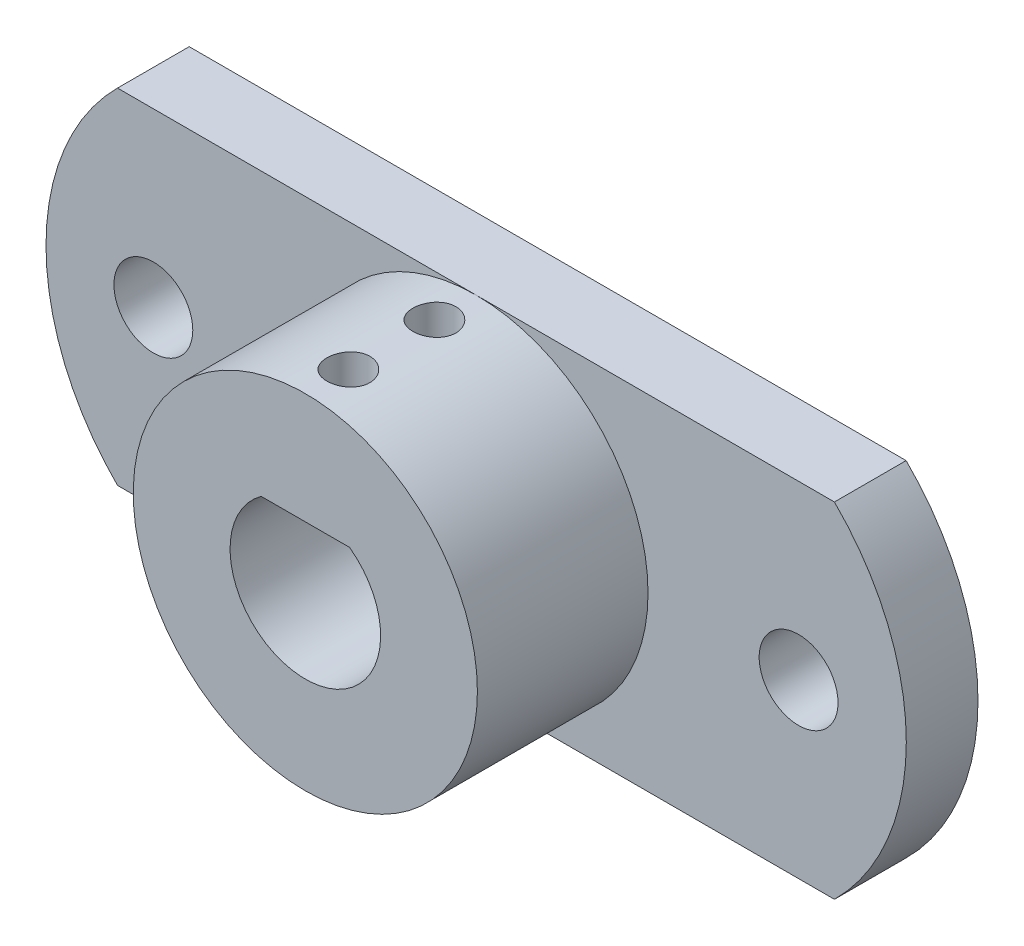
ISO-10303-21;
HEADER;
FILE_DESCRIPTION(('STEP AP214'),'2;1');
FILE_NAME('part.step','',(''),(''),'','','');
FILE_SCHEMA(('AUTOMOTIVE_DESIGN { 1 0 10303 214 1 1 1 1 }'));
ENDSEC;
DATA;
#1=APPLICATION_CONTEXT('core data for automotive mechanical design processes');
#2=APPLICATION_PROTOCOL_DEFINITION('international standard','automotive_design',2000,#1);
#3=PRODUCT_CONTEXT('',#1,'mechanical');
#4=PRODUCT('Part','Part','',(#3));
#5=PRODUCT_RELATED_PRODUCT_CATEGORY('part','',(#4));
#6=PRODUCT_DEFINITION_FORMATION('','',#4);
#7=PRODUCT_DEFINITION_CONTEXT('part definition',#1,'design');
#8=PRODUCT_DEFINITION('design','',#6,#7);
#9=PRODUCT_DEFINITION_SHAPE('','',#8);
#10=(LENGTH_UNIT() NAMED_UNIT(*) SI_UNIT(.MILLI.,.METRE.));
#11=(NAMED_UNIT(*) PLANE_ANGLE_UNIT() SI_UNIT($,.RADIAN.));
#12=(NAMED_UNIT(*) SI_UNIT($,.STERADIAN.) SOLID_ANGLE_UNIT());
#13=UNCERTAINTY_MEASURE_WITH_UNIT(LENGTH_MEASURE(1.E-05),#10,'distance_accuracy_value','');
#14=(GEOMETRIC_REPRESENTATION_CONTEXT(3) GLOBAL_UNCERTAINTY_ASSIGNED_CONTEXT((#13)) GLOBAL_UNIT_ASSIGNED_CONTEXT((#10,
#11,#12)) REPRESENTATION_CONTEXT('',''));
#15=CARTESIAN_POINT('',(0.,0.,0.));
#16=DIRECTION('',(0.,0.,1.));
#17=DIRECTION('',(1.,0.,0.));
#18=AXIS2_PLACEMENT_3D('',#15,#16,#17);
#19=CARTESIAN_POINT('',(-13.0564979088763,-12.,2.5));
#20=DIRECTION('',(0.,0.,1.));
#21=DIRECTION('',(1.,0.,0.));
#22=AXIS2_PLACEMENT_3D('',#19,#20,#21);
#23=PLANE('',#22);
#24=CARTESIAN_POINT('',(0.,-12.,2.5));
#25=DIRECTION('',(0.,0.,1.));
#26=DIRECTION('',(1.,0.,0.));
#27=AXIS2_PLACEMENT_3D('',#24,#25,#26);
#28=CIRCLE('',#27,12.);
#29=CARTESIAN_POINT('',(0.,0.,2.5));
#30=VERTEX_POINT('',#29);
#31=CARTESIAN_POINT('',(0.,-24.,2.5));
#32=VERTEX_POINT('',#31);
#33=EDGE_CURVE('E45',#30,#32,#28,.T.);
#34=ORIENTED_EDGE('',*,*,#33,.F.);
#35=DIRECTION('',(-1.,0.,0.));
#36=VECTOR('',#35,1.);
#37=CARTESIAN_POINT('',(-25.,0.,2.5));
#38=LINE('',#37,#36);
#39=CARTESIAN_POINT('',(-25.,0.,2.5));
#40=VERTEX_POINT('',#39);
#41=EDGE_CURVE('E143',#30,#40,#38,.T.);
#42=ORIENTED_EDGE('',*,*,#41,.T.);
#43=CARTESIAN_POINT('',(-13.0564979088763,-12.,2.5));
#44=DIRECTION('',(0.,0.,1.));
#45=DIRECTION('',(1.,0.,0.));
#46=AXIS2_PLACEMENT_3D('',#43,#44,#45);
#47=CIRCLE('',#46,16.9306598276817);
#48=CARTESIAN_POINT('',(-25.,-24.,2.5));
#49=VERTEX_POINT('',#48);
#50=EDGE_CURVE('E133',#40,#49,#47,.T.);
#51=ORIENTED_EDGE('',*,*,#50,.T.);
#52=DIRECTION('',(1.,0.,0.));
#53=VECTOR('',#52,1.);
#54=CARTESIAN_POINT('',(-25.,-24.,2.5));
#55=LINE('',#54,#53);
#56=EDGE_CURVE('E138',#49,#32,#55,.T.);
#57=ORIENTED_EDGE('',*,*,#56,.T.);
#58=EDGE_LOOP('',(#34,#42,#51,#57));
#59=FACE_BOUND('',#58,.T.);
#60=CARTESIAN_POINT('',(-22.5,-12.,2.5));
#61=DIRECTION('',(0.,0.,1.));
#62=DIRECTION('',(1.,0.,0.));
#63=AXIS2_PLACEMENT_3D('',#60,#61,#62);
#64=CIRCLE('',#63,2.75);
#65=CARTESIAN_POINT('',(-19.75,-12.,2.5));
#66=VERTEX_POINT('',#65);
#67=EDGE_CURVE('E121',#66,#66,#64,.T.);
#68=ORIENTED_EDGE('',*,*,#67,.F.);
#69=EDGE_LOOP('',(#68));
#70=FACE_BOUND('',#69,.T.);
#71=ADVANCED_FACE('F35',(#59,#70),#23,.T.);
#72=EDGE_CURVE('E11',#32,#30,#28,.T.);
#73=ORIENTED_EDGE('',*,*,#72,.F.);
#74=CARTESIAN_POINT('',(25.,-24.,2.5));
#75=VERTEX_POINT('',#74);
#76=EDGE_CURVE('E136',#32,#75,#55,.T.);
#77=ORIENTED_EDGE('',*,*,#76,.T.);
#78=CARTESIAN_POINT('',(13.143312097733,-12.,2.5));
#79=DIRECTION('',(0.,0.,1.));
#80=DIRECTION('',(1.,0.,0.));
#81=AXIS2_PLACEMENT_3D('',#78,#79,#80);
#82=CIRCLE('',#81,16.869530165709);
#83=CARTESIAN_POINT('',(25.,0.,2.5));
#84=VERTEX_POINT('',#83);
#85=EDGE_CURVE('E141',#75,#84,#82,.T.);
#86=ORIENTED_EDGE('',*,*,#85,.T.);
#87=EDGE_CURVE('E144',#84,#30,#38,.T.);
#88=ORIENTED_EDGE('',*,*,#87,.T.);
#89=EDGE_LOOP('',(#73,#77,#86,#88));
#90=FACE_BOUND('',#89,.T.);
#91=CARTESIAN_POINT('',(22.5,-12.,2.5));
#92=DIRECTION('',(0.,0.,1.));
#93=DIRECTION('',(1.,0.,0.));
#94=AXIS2_PLACEMENT_3D('',#91,#92,#93);
#95=CIRCLE('',#94,2.75);
#96=CARTESIAN_POINT('',(25.25,-12.,2.5));
#97=VERTEX_POINT('',#96);
#98=EDGE_CURVE('E127',#97,#97,#95,.T.);
#99=ORIENTED_EDGE('',*,*,#98,.F.);
#100=EDGE_LOOP('',(#99));
#101=FACE_BOUND('',#100,.T.);
#102=ADVANCED_FACE('F183',(#90,#101),#23,.T.);
#103=CARTESIAN_POINT('',(-13.0564979088763,-12.,-2.5));
#104=DIRECTION('',(0.,0.,1.));
#105=DIRECTION('',(1.,0.,0.));
#106=AXIS2_PLACEMENT_3D('',#103,#104,#105);
#107=PLANE('',#106);
#108=CARTESIAN_POINT('',(-13.0564979088763,-12.,-2.5));
#109=DIRECTION('',(0.,0.,1.));
#110=DIRECTION('',(1.,0.,0.));
#111=AXIS2_PLACEMENT_3D('',#108,#109,#110);
#112=CIRCLE('',#111,16.9306598276817);
#113=CARTESIAN_POINT('',(-25.,0.,-2.5));
#114=VERTEX_POINT('',#113);
#115=CARTESIAN_POINT('',(-25.,-24.,-2.5));
#116=VERTEX_POINT('',#115);
#117=EDGE_CURVE('E130',#114,#116,#112,.T.);
#118=ORIENTED_EDGE('',*,*,#117,.F.);
#119=DIRECTION('',(-1.,0.,0.));
#120=VECTOR('',#119,1.);
#121=CARTESIAN_POINT('',(-25.,0.,-2.5));
#122=LINE('',#121,#120);
#123=CARTESIAN_POINT('',(25.,0.,-2.5));
#124=VERTEX_POINT('',#123);
#125=EDGE_CURVE('E137',#124,#114,#122,.T.);
#126=ORIENTED_EDGE('',*,*,#125,.F.);
#127=CARTESIAN_POINT('',(13.143312097733,-12.,-2.5));
#128=DIRECTION('',(0.,0.,1.));
#129=DIRECTION('',(1.,0.,0.));
#130=AXIS2_PLACEMENT_3D('',#127,#128,#129);
#131=CIRCLE('',#130,16.869530165709);
#132=CARTESIAN_POINT('',(25.,-24.,-2.5));
#133=VERTEX_POINT('',#132);
#134=EDGE_CURVE('E151',#133,#124,#131,.T.);
#135=ORIENTED_EDGE('',*,*,#134,.F.);
#136=DIRECTION('',(1.,0.,0.));
#137=VECTOR('',#136,1.);
#138=CARTESIAN_POINT('',(-25.,-24.,-2.5));
#139=LINE('',#138,#137);
#140=EDGE_CURVE('E149',#116,#133,#139,.T.);
#141=ORIENTED_EDGE('',*,*,#140,.F.);
#142=EDGE_LOOP('',(#118,#126,#135,#141));
#143=FACE_BOUND('',#142,.T.);
#144=CARTESIAN_POINT('',(22.5,-12.,-2.5));
#145=DIRECTION('',(0.,0.,1.));
#146=DIRECTION('',(1.,0.,0.));
#147=AXIS2_PLACEMENT_3D('',#144,#145,#146);
#148=CIRCLE('',#147,2.75);
#149=CARTESIAN_POINT('',(25.25,-12.,-2.5));
#150=VERTEX_POINT('',#149);
#151=EDGE_CURVE('E124',#150,#150,#148,.T.);
#152=ORIENTED_EDGE('',*,*,#151,.T.);
#153=EDGE_LOOP('',(#152));
#154=FACE_BOUND('',#153,.T.);
#155=CARTESIAN_POINT('',(-22.5,-12.,-2.5));
#156=DIRECTION('',(0.,0.,1.));
#157=DIRECTION('',(1.,0.,0.));
#158=AXIS2_PLACEMENT_3D('',#155,#156,#157);
#159=CIRCLE('',#158,2.75);
#160=CARTESIAN_POINT('',(-19.75,-12.,-2.5));
#161=VERTEX_POINT('',#160);
#162=EDGE_CURVE('E118',#161,#161,#159,.T.);
#163=ORIENTED_EDGE('',*,*,#162,.T.);
#164=EDGE_LOOP('',(#163));
#165=FACE_BOUND('',#164,.T.);
#166=ADVANCED_FACE('F174',(#143,#154,#165),#107,.F.);
#167=CARTESIAN_POINT('',(-13.0564979088763,-12.,2.5));
#168=DIRECTION('',(0.,0.,-1.));
#169=DIRECTION('',(-1.,0.,0.));
#170=AXIS2_PLACEMENT_3D('',#167,#168,#169);
#171=CYLINDRICAL_SURFACE('',#170,16.9306598276817);
#172=ORIENTED_EDGE('',*,*,#117,.T.);
#173=DIRECTION('',(0.,0.,-1.));
#174=VECTOR('',#173,1.);
#175=CARTESIAN_POINT('',(-25.,-24.,2.5));
#176=LINE('',#175,#174);
#177=EDGE_CURVE('E39',#49,#116,#176,.T.);
#178=ORIENTED_EDGE('',*,*,#177,.F.);
#179=ORIENTED_EDGE('',*,*,#50,.F.);
#180=DIRECTION('',(0.,0.,-1.));
#181=VECTOR('',#180,1.);
#182=CARTESIAN_POINT('',(-25.,0.,2.5));
#183=LINE('',#182,#181);
#184=EDGE_CURVE('E146',#40,#114,#183,.T.);
#185=ORIENTED_EDGE('',*,*,#184,.T.);
#186=EDGE_LOOP('',(#172,#178,#179,#185));
#187=FACE_BOUND('',#186,.T.);
#188=ADVANCED_FACE('F37',(#187),#171,.T.);
#189=CARTESIAN_POINT('',(-25.,-24.,2.5));
#190=DIRECTION('',(0.,1.,0.));
#191=DIRECTION('',(0.,0.,1.));
#192=AXIS2_PLACEMENT_3D('',#189,#190,#191);
#193=PLANE('',#192);
#194=ORIENTED_EDGE('',*,*,#140,.T.);
#195=DIRECTION('',(0.,0.,-1.));
#196=VECTOR('',#195,1.);
#197=CARTESIAN_POINT('',(25.,-24.,2.5));
#198=LINE('',#197,#196);
#199=EDGE_CURVE('E158',#75,#133,#198,.T.);
#200=ORIENTED_EDGE('',*,*,#199,.F.);
#201=ORIENTED_EDGE('',*,*,#76,.F.);
#202=ORIENTED_EDGE('',*,*,#56,.F.);
#203=ORIENTED_EDGE('',*,*,#177,.T.);
#204=EDGE_LOOP('',(#194,#200,#201,#202,#203));
#205=FACE_BOUND('',#204,.T.);
#206=ADVANCED_FACE('F167',(#205),#193,.F.);
#207=CARTESIAN_POINT('',(13.143312097733,-12.,2.5));
#208=DIRECTION('',(0.,0.,-1.));
#209=DIRECTION('',(-1.,0.,0.));
#210=AXIS2_PLACEMENT_3D('',#207,#208,#209);
#211=CYLINDRICAL_SURFACE('',#210,16.869530165709);
#212=ORIENTED_EDGE('',*,*,#134,.T.);
#213=DIRECTION('',(0.,0.,-1.));
#214=VECTOR('',#213,1.);
#215=CARTESIAN_POINT('',(25.,0.,2.5));
#216=LINE('',#215,#214);
#217=EDGE_CURVE('E156',#84,#124,#216,.T.);
#218=ORIENTED_EDGE('',*,*,#217,.F.);
#219=ORIENTED_EDGE('',*,*,#85,.F.);
#220=ORIENTED_EDGE('',*,*,#199,.T.);
#221=EDGE_LOOP('',(#212,#218,#219,#220));
#222=FACE_BOUND('',#221,.T.);
#223=ADVANCED_FACE('F177',(#222),#211,.T.);
#224=CARTESIAN_POINT('',(-25.,0.,2.5));
#225=DIRECTION('',(0.,-1.,0.));
#226=DIRECTION('',(1.,0.,0.));
#227=AXIS2_PLACEMENT_3D('',#224,#225,#226);
#228=PLANE('',#227);
#229=ORIENTED_EDGE('',*,*,#125,.T.);
#230=ORIENTED_EDGE('',*,*,#184,.F.);
#231=ORIENTED_EDGE('',*,*,#41,.F.);
#232=ORIENTED_EDGE('',*,*,#87,.F.);
#233=ORIENTED_EDGE('',*,*,#217,.T.);
#234=EDGE_LOOP('',(#229,#230,#231,#232,#233));
#235=FACE_BOUND('',#234,.T.);
#236=ADVANCED_FACE('F180',(#235),#228,.F.);
#237=CARTESIAN_POINT('',(22.5,-12.,2.5));
#238=DIRECTION('',(0.,0.,-1.));
#239=DIRECTION('',(-1.,0.,0.));
#240=AXIS2_PLACEMENT_3D('',#237,#238,#239);
#241=CYLINDRICAL_SURFACE('',#240,2.75);
#242=ORIENTED_EDGE('',*,*,#98,.T.);
#243=EDGE_LOOP('',(#242));
#244=FACE_BOUND('',#243,.T.);
#245=ORIENTED_EDGE('',*,*,#151,.F.);
#246=EDGE_LOOP('',(#245));
#247=FACE_BOUND('',#246,.T.);
#248=ADVANCED_FACE('F200',(#244,#247),#241,.F.);
#249=CARTESIAN_POINT('',(-22.5,-12.,2.5));
#250=DIRECTION('',(0.,0.,-1.));
#251=DIRECTION('',(-1.,0.,0.));
#252=AXIS2_PLACEMENT_3D('',#249,#250,#251);
#253=CYLINDRICAL_SURFACE('',#252,2.75);
#254=ORIENTED_EDGE('',*,*,#67,.T.);
#255=EDGE_LOOP('',(#254));
#256=FACE_BOUND('',#255,.T.);
#257=ORIENTED_EDGE('',*,*,#162,.F.);
#258=EDGE_LOOP('',(#257));
#259=FACE_BOUND('',#258,.T.);
#260=ADVANCED_FACE('F191',(#256,#259),#253,.F.);
#261=CARTESIAN_POINT('',(0.,-12.,14.4));
#262=DIRECTION('',(0.,0.,-1.));
#263=DIRECTION('',(-1.,0.,0.));
#264=AXIS2_PLACEMENT_3D('',#261,#262,#263);
#265=CYLINDRICAL_SURFACE('',#264,12.);
#266=CARTESIAN_POINT('',(0.,0.,3.9));
#267=CARTESIAN_POINT('',(0.0839046573334568,-1.17062142931432E-06,3.90000356456143));
#268=CARTESIAN_POINT('',(0.167861744581648,-0.000889292670590313,3.90706372750157));
#269=CARTESIAN_POINT('',(0.333439681253852,-0.00434675933183943,3.93511665274248));
#270=CARTESIAN_POINT('',(0.415057998374247,-0.00691785935142624,3.95612396275403));
#271=CARTESIAN_POINT('',(0.573537344887833,-0.0134516337335631,4.01144258634845));
#272=CARTESIAN_POINT('',(0.650401536087683,-0.0174133712667472,4.04574494508591));
#273=CARTESIAN_POINT('',(0.797267684935822,-0.0262877947314137,4.12666037038188));
#274=CARTESIAN_POINT('',(0.867270816933823,-0.0312003174953041,4.17327132511843));
#275=CARTESIAN_POINT('',(0.99882769015879,-0.0414580721620438,4.27775516990376));
#276=CARTESIAN_POINT('',(1.06033821896228,-0.0468053118454965,4.33568227760774));
#277=CARTESIAN_POINT('',(1.1727916761345,-0.0573136439414972,4.46103769412199));
#278=CARTESIAN_POINT('',(1.22373406583535,-0.0624747268543901,4.52846648694795));
#279=CARTESIAN_POINT('',(1.31376609677036,-0.072046166282491,4.6711919865394));
#280=CARTESIAN_POINT('',(1.35281525756464,-0.076453936932533,4.74651441694077));
#281=CARTESIAN_POINT('',(1.41769384594507,-0.0839932292539044,4.90271223116842));
#282=CARTESIAN_POINT('',(1.44352377483913,-0.0871247993211864,4.98358740428821));
#283=CARTESIAN_POINT('',(1.48109938801486,-0.091737962378319,5.14814651735206));
#284=CARTESIAN_POINT('',(1.49291802883902,-0.0932280993795317,5.23181355462252));
#285=CARTESIAN_POINT('',(1.50236132973434,-0.0944158311432489,5.3999557580831));
#286=CARTESIAN_POINT('',(1.49998656060145,-0.0941134979909518,5.48443089163877));
#287=CARTESIAN_POINT('',(1.48117034186874,-0.0917582677814881,5.65128289634927));
#288=CARTESIAN_POINT('',(1.46480925779082,-0.0897153722380293,5.73366899172016));
#289=CARTESIAN_POINT('',(1.41861022990923,-0.0841248014542288,5.89451701273139));
#290=CARTESIAN_POINT('',(1.38877201305114,-0.0805770957256601,5.97297885882842));
#291=CARTESIAN_POINT('',(1.31637933594699,-0.0723653048120923,6.12400079941301));
#292=CARTESIAN_POINT('',(1.27378995222458,-0.0676981607313357,6.19654398014939));
#293=CARTESIAN_POINT('',(1.17712888167415,-0.0577757314164156,6.33348401664795));
#294=CARTESIAN_POINT('',(1.12305666964847,-0.0525204192860254,6.39788049958421));
#295=CARTESIAN_POINT('',(1.00451946645227,-0.0419693406574511,6.51716562643365));
#296=CARTESIAN_POINT('',(0.939985204704006,-0.0366735456786602,6.57198545505959));
#297=CARTESIAN_POINT('',(0.802594301468353,-0.0266722046648852,6.67002532801833));
#298=CARTESIAN_POINT('',(0.72973764079095,-0.0219666599909685,6.7132453456032));
#299=CARTESIAN_POINT('',(0.577717002818088,-0.0136730866885221,6.78685879227835));
#300=CARTESIAN_POINT('',(0.498550917202629,-0.0100854335907812,6.81724791232874));
#301=CARTESIAN_POINT('',(0.336184764258633,-0.00443528531963272,6.86428229611395));
#302=CARTESIAN_POINT('',(0.2529848859784,-0.00237271874478478,6.88092820328223));
#303=CARTESIAN_POINT('',(0.0855078983480979,-1.44215354400202E-05,6.89991445455633));
#304=CARTESIAN_POINT('',(0.00124169411916386,0.000293016855811702,6.90234959541844));
#305=CARTESIAN_POINT('',(-0.166497621898498,-0.000861971967422323,6.89309535956643));
#306=CARTESIAN_POINT('',(-0.249970750538824,-0.00232436149072459,6.88140628364904));
#307=CARTESIAN_POINT('',(-0.413474704632913,-0.00684738745985124,6.84431417473537));
#308=CARTESIAN_POINT('',(-0.493515942254823,-0.00990275511679224,6.81895634195842));
#309=CARTESIAN_POINT('',(-0.648209792915044,-0.0172696613988188,6.75529352885225));
#310=CARTESIAN_POINT('',(-0.722862222879189,-0.0215812426762598,6.71698810890514));
#311=CARTESIAN_POINT('',(-0.865082712412456,-0.0310090625393267,6.62828811749552));
#312=CARTESIAN_POINT('',(-0.932612255966292,-0.0361293357449474,6.57783222611662));
#313=CARTESIAN_POINT('',(-1.05827819377579,-0.0465891460460638,6.46635030147948));
#314=CARTESIAN_POINT('',(-1.11641421500212,-0.0519286918386125,6.40532384864941));
#315=CARTESIAN_POINT('',(-1.22197917529081,-0.0622613672244961,6.27401554994572));
#316=CARTESIAN_POINT('',(-1.26934527634076,-0.0672523516720403,6.20368299221376));
#317=CARTESIAN_POINT('',(-1.3515917336661,-0.0762875337771113,6.05600505308717));
#318=CARTESIAN_POINT('',(-1.38647234023702,-0.0803317504138403,5.97865981231409));
#319=CARTESIAN_POINT('',(-1.44265594731992,-0.0870008976420307,5.81935480851143));
#320=CARTESIAN_POINT('',(-1.46399437647427,-0.0896295288912701,5.73740770197122));
#321=CARTESIAN_POINT('',(-1.49260199632071,-0.0931805045552727,5.5710585097316));
#322=CARTESIAN_POINT('',(-1.49987184152146,-0.0941029283473419,5.4866565384246));
#323=CARTESIAN_POINT('',(-1.5001239216509,-0.094134738105271,5.31841864247719));
#324=CARTESIAN_POINT('',(-1.49320487861956,-0.0932566514882796,5.23458285100087));
#325=CARTESIAN_POINT('',(-1.4654846429096,-0.0898133127767923,5.06927572239295));
#326=CARTESIAN_POINT('',(-1.44468344874346,-0.0872480605015127,4.98780438551472));
#327=CARTESIAN_POINT('',(-1.38982024421379,-0.0807233053527023,4.82955182594016));
#328=CARTESIAN_POINT('',(-1.35576298858256,-0.0767643024432989,4.75276893298691));
#329=CARTESIAN_POINT('',(-1.27536414129019,-0.0678973005310884,4.60599200757101));
#330=CARTESIAN_POINT('',(-1.22902239570575,-0.0629892896375255,4.5359980601881));
#331=CARTESIAN_POINT('',(-1.1250037987595,-0.0527363714866023,4.40428126479572));
#332=CARTESIAN_POINT('',(-1.06725337546497,-0.0473887674958037,4.34261672342701));
#333=CARTESIAN_POINT('',(-0.942210136181029,-0.0368830104426004,4.22981590489922));
#334=CARTESIAN_POINT('',(-0.87491507348494,-0.0317249023464588,4.17868211353541));
#335=CARTESIAN_POINT('',(-0.732399372512526,-0.0221576604795203,4.08822878573682));
#336=CARTESIAN_POINT('',(-0.657149567757702,-0.0177514495301935,4.04895491646045));
#337=CARTESIAN_POINT('',(-0.501109741380769,-0.0102141055396504,3.98365725425023));
#338=CARTESIAN_POINT('',(-0.420325848522142,-0.00708158778255149,3.95761906418792));
#339=CARTESIAN_POINT('',(-0.282603463180755,-0.00319967803352443,3.92576439709722));
#340=CARTESIAN_POINT('',(-0.226533398110152,-0.00200564462727877,3.91611663481076));
#341=CARTESIAN_POINT('',(-0.113650237927461,-0.000405412024868778,3.90323325258407));
#342=CARTESIAN_POINT('',(-0.0568371482976164,7.92980817666425E-07,3.89999758536042));
#343=CARTESIAN_POINT('',(0.,0.,3.9));
#344=B_SPLINE_CURVE_WITH_KNOTS('',3,(#266,#267,#268,#269,#270,#271,#272,#273,#274,#275,#276,
#277,#278,#279,#280,#281,#282,#283,#284,#285,#286,#287,#288,#289,#290,#291,#292,#293,#294,#295,
#296,#297,#298,#299,#300,#301,#302,#303,#304,#305,#306,#307,#308,#309,#310,#311,#312,#313,#314,
#315,#316,#317,#318,#319,#320,#321,#322,#323,#324,#325,#326,#327,#328,#329,#330,#331,#332,#333,
#334,#335,#336,#337,#338,#339,#340,#341,#342,#343),.UNSPECIFIED.,.T.,.F.,(4,2,2,2,2,2,2,2,2,2,2,
2,2,2,2,2,2,2,2,2,2,2,2,2,2,2,2,2,2,2,2,2,2,2,2,2,2,2,4),(0.,0.251506363665748,
0.503275476566056,0.754875304909063,1.00643199354644,1.25922487921106,1.51203064680006,
1.76568750191322,2.01933473698084,2.27165535171792,2.52396581930798,2.77483617865015,
3.02571162099745,3.2772805577132,3.52886100308183,3.7821808688185,4.03550131867868,
4.28890677438963,4.54230036542268,4.79400167635153,5.04569762701157,5.29656632336038,
5.54744353847369,5.79961441757053,6.05179530825053,6.30541182904544,6.55902326532923,
6.81196844568555,7.06490185806374,7.31608140721329,7.56726098327729,7.81835054823893,
8.06944325947358,8.32221142615098,8.57503919082008,8.82882841822112,9.0823409921042,
9.25271305912577,9.42308386980262),.UNSPECIFIED.);
#345=CARTESIAN_POINT('',(0.,0.,3.9));
#346=VERTEX_POINT('',#345);
#347=EDGE_CURVE('E313',#346,#346,#344,.T.);
#348=ORIENTED_EDGE('',*,*,#347,.T.);
#349=EDGE_LOOP('',(#348));
#350=FACE_BOUND('',#349,.T.);
#351=CARTESIAN_POINT('',(0.,0.,9.9));
#352=CARTESIAN_POINT('',(0.0839046573334568,-1.17062142932141E-06,9.90000356456143));
#353=CARTESIAN_POINT('',(0.167861744581648,-0.000889292670590324,9.90706372750157));
#354=CARTESIAN_POINT('',(0.333439681253851,-0.00434675933183943,9.93511665274248));
#355=CARTESIAN_POINT('',(0.415057998374247,-0.00691785935142624,9.95612396275403));
#356=CARTESIAN_POINT('',(0.573537344887832,-0.0134516337335631,10.0114425863484));
#357=CARTESIAN_POINT('',(0.650401536087683,-0.0174133712667472,10.0457449450859));
#358=CARTESIAN_POINT('',(0.797267684935821,-0.0262877947314137,10.1266603703819));
#359=CARTESIAN_POINT('',(0.867270816933822,-0.0312003174953041,10.1732713251184));
#360=CARTESIAN_POINT('',(0.99882769015879,-0.0414580721620438,10.2777551699038));
#361=CARTESIAN_POINT('',(1.06033821896228,-0.0468053118454965,10.3356822776077));
#362=CARTESIAN_POINT('',(1.1727916761345,-0.0573136439414972,10.461037694122));
#363=CARTESIAN_POINT('',(1.22373406583535,-0.0624747268543901,10.5284664869479));
#364=CARTESIAN_POINT('',(1.31376609677036,-0.072046166282491,10.6711919865394));
#365=CARTESIAN_POINT('',(1.35281525756464,-0.076453936932533,10.7465144169408));
#366=CARTESIAN_POINT('',(1.41769384594507,-0.0839932292539044,10.9027122311684));
#367=CARTESIAN_POINT('',(1.44352377483913,-0.0871247993211864,10.9835874042882));
#368=CARTESIAN_POINT('',(1.48109938801486,-0.091737962378319,11.1481465173521));
#369=CARTESIAN_POINT('',(1.49291802883902,-0.0932280993795317,11.2318135546225));
#370=CARTESIAN_POINT('',(1.50236132973434,-0.094415831143249,11.3999557580831));
#371=CARTESIAN_POINT('',(1.49998656060145,-0.0941134979909518,11.4844308916388));
#372=CARTESIAN_POINT('',(1.48117034186874,-0.0917582677814882,11.6512828963493));
#373=CARTESIAN_POINT('',(1.46480925779082,-0.0897153722380293,11.7336689917202));
#374=CARTESIAN_POINT('',(1.41861022990923,-0.0841248014542289,11.8945170127314));
#375=CARTESIAN_POINT('',(1.38877201305114,-0.0805770957256601,11.9729788588284));
#376=CARTESIAN_POINT('',(1.31637933594699,-0.0723653048120925,12.124000799413));
#377=CARTESIAN_POINT('',(1.27378995222458,-0.0676981607313358,12.1965439801494));
#378=CARTESIAN_POINT('',(1.17712888167415,-0.0577757314164157,12.3334840166479));
#379=CARTESIAN_POINT('',(1.12305666964847,-0.0525204192860256,12.3978804995842));
#380=CARTESIAN_POINT('',(1.00451946645227,-0.0419693406574513,12.5171656264336));
#381=CARTESIAN_POINT('',(0.939985204704008,-0.0366735456786604,12.5719854550596));
#382=CARTESIAN_POINT('',(0.802594301468355,-0.0266722046648854,12.6700253280183));
#383=CARTESIAN_POINT('',(0.729737640790952,-0.0219666599909687,12.7132453456032));
#384=CARTESIAN_POINT('',(0.57771700281809,-0.0136730866885222,12.7868587922783));
#385=CARTESIAN_POINT('',(0.498550917202631,-0.0100854335907814,12.8172479123287));
#386=CARTESIAN_POINT('',(0.336184764258635,-0.00443528531963285,12.864282296114));
#387=CARTESIAN_POINT('',(0.252984885978401,-0.0023727187447849,12.8809282032822));
#388=CARTESIAN_POINT('',(0.0855078983480998,-1.44215354401182E-05,12.8999144545563));
#389=CARTESIAN_POINT('',(0.00124169411916571,0.000293016855811621,12.9023495954184));
#390=CARTESIAN_POINT('',(-0.166497621898496,-0.000861971967422364,12.8930953595664));
#391=CARTESIAN_POINT('',(-0.249970750538823,-0.00232436149072461,12.881406283649));
#392=CARTESIAN_POINT('',(-0.413474704632912,-0.00684738745985126,12.8443141747354));
#393=CARTESIAN_POINT('',(-0.493515942254822,-0.00990275511679226,12.8189563419584));
#394=CARTESIAN_POINT('',(-0.648209792915043,-0.0172696613988188,12.7552935288523));
#395=CARTESIAN_POINT('',(-0.722862222879187,-0.0215812426762598,12.7169881089051));
#396=CARTESIAN_POINT('',(-0.865082712412455,-0.0310090625393266,12.6282881174955));
#397=CARTESIAN_POINT('',(-0.932612255966291,-0.0361293357449474,12.5778322261166));
#398=CARTESIAN_POINT('',(-1.05827819377579,-0.0465891460460638,12.4663503014795));
#399=CARTESIAN_POINT('',(-1.11641421500211,-0.0519286918386124,12.4053238486494));
#400=CARTESIAN_POINT('',(-1.22197917529081,-0.0622613672244961,12.2740155499457));
#401=CARTESIAN_POINT('',(-1.26934527634076,-0.0672523516720404,12.2036829922138));
#402=CARTESIAN_POINT('',(-1.3515917336661,-0.0762875337771115,12.0560050530872));
#403=CARTESIAN_POINT('',(-1.38647234023702,-0.0803317504138404,11.9786598123141));
#404=CARTESIAN_POINT('',(-1.44265594731992,-0.0870008976420307,11.8193548085114));
#405=CARTESIAN_POINT('',(-1.46399437647426,-0.0896295288912701,11.7374077019712));
#406=CARTESIAN_POINT('',(-1.49260199632071,-0.0931805045552727,11.5710585097316));
#407=CARTESIAN_POINT('',(-1.49987184152146,-0.0941029283473419,11.4866565384246));
#408=CARTESIAN_POINT('',(-1.5001239216509,-0.0941347381052711,11.3184186424772));
#409=CARTESIAN_POINT('',(-1.49320487861956,-0.0932566514882799,11.2345828510009));
#410=CARTESIAN_POINT('',(-1.4654846429096,-0.0898133127767926,11.069275722393));
#411=CARTESIAN_POINT('',(-1.44468344874346,-0.087248060501513,10.9878043855147));
#412=CARTESIAN_POINT('',(-1.38982024421379,-0.0807233053527022,10.8295518259402));
#413=CARTESIAN_POINT('',(-1.35576298858256,-0.0767643024432984,10.7527689329869));
#414=CARTESIAN_POINT('',(-1.27536414129019,-0.067897300531087,10.605992007571));
#415=CARTESIAN_POINT('',(-1.22902239570575,-0.0629892896375235,10.5359980601881));
#416=CARTESIAN_POINT('',(-1.1250037987595,-0.0527363714866013,10.4042812647957));
#417=CARTESIAN_POINT('',(-1.06725337546498,-0.0473887674958042,10.342616723427));
#418=CARTESIAN_POINT('',(-0.942210136181032,-0.0368830104426017,10.2298159048992));
#419=CARTESIAN_POINT('',(-0.874915073484942,-0.0317249023464592,10.1786821135354));
#420=CARTESIAN_POINT('',(-0.732399372512528,-0.0221576604795203,10.0882287857368));
#421=CARTESIAN_POINT('',(-0.657149567757703,-0.0177514495301938,10.0489549164604));
#422=CARTESIAN_POINT('',(-0.50110974138077,-0.0102141055396508,9.98365725425023));
#423=CARTESIAN_POINT('',(-0.420325848522143,-0.00708158778255165,9.95761906418793));
#424=CARTESIAN_POINT('',(-0.282603463180756,-0.00319967803352445,9.92576439709722));
#425=CARTESIAN_POINT('',(-0.226533398110154,-0.00200564462727878,9.91611663481076));
#426=CARTESIAN_POINT('',(-0.113650237927462,-0.000405412024868774,9.90323325258407));
#427=CARTESIAN_POINT('',(-0.0568371482976168,7.92980817671234E-07,9.89999758536042));
#428=CARTESIAN_POINT('',(0.,0.,9.9));
#429=B_SPLINE_CURVE_WITH_KNOTS('',3,(#351,#352,#353,#354,#355,#356,#357,#358,#359,#360,#361,
#362,#363,#364,#365,#366,#367,#368,#369,#370,#371,#372,#373,#374,#375,#376,#377,#378,#379,#380,
#381,#382,#383,#384,#385,#386,#387,#388,#389,#390,#391,#392,#393,#394,#395,#396,#397,#398,#399,
#400,#401,#402,#403,#404,#405,#406,#407,#408,#409,#410,#411,#412,#413,#414,#415,#416,#417,#418,
#419,#420,#421,#422,#423,#424,#425,#426,#427,#428),.UNSPECIFIED.,.T.,.F.,(4,2,2,2,2,2,2,2,2,2,2,
2,2,2,2,2,2,2,2,2,2,2,2,2,2,2,2,2,2,2,2,2,2,2,2,2,2,2,4),(0.,0.251506363665748,
0.503275476566056,0.754875304909062,1.00643199354644,1.25922487921106,1.51203064680006,
1.76568750191322,2.01933473698084,2.27165535171792,2.52396581930798,2.77483617865015,
3.02571162099745,3.2772805577132,3.52886100308183,3.7821808688185,4.03550131867868,
4.28890677438963,4.54230036542268,4.79400167635153,5.04569762701157,5.29656632336037,
5.54744353847368,5.79961441757053,6.05179530825053,6.30541182904544,6.55902326532923,
6.81196844568555,7.06490185806374,7.31608140721329,7.56726098327729,7.81835054823892,
8.06944325947358,8.32221142615098,8.57503919082007,8.82882841822112,9.08234099210419,
9.25271305912577,9.42308386980262),.UNSPECIFIED.);
#430=CARTESIAN_POINT('',(0.,0.,9.9));
#431=VERTEX_POINT('',#430);
#432=EDGE_CURVE('E113',#431,#431,#429,.T.);
#433=ORIENTED_EDGE('',*,*,#432,.T.);
#434=EDGE_LOOP('',(#433));
#435=FACE_BOUND('',#434,.T.);
#436=CARTESIAN_POINT('',(0.,-12.,14.4));
#437=DIRECTION('',(0.,0.,1.));
#438=DIRECTION('',(1.,0.,0.));
#439=AXIS2_PLACEMENT_3D('',#436,#437,#438);
#440=CIRCLE('',#439,12.);
#441=CARTESIAN_POINT('',(12.,-12.,14.4));
#442=VERTEX_POINT('',#441);
#443=EDGE_CURVE('E116',#442,#442,#440,.T.);
#444=ORIENTED_EDGE('',*,*,#443,.F.);
#445=EDGE_LOOP('',(#444));
#446=FACE_BOUND('',#445,.T.);
#447=ORIENTED_EDGE('',*,*,#33,.T.);
#448=ORIENTED_EDGE('',*,*,#72,.T.);
#449=EDGE_LOOP('',(#447,#448));
#450=FACE_BOUND('',#449,.T.);
#451=ADVANCED_FACE('F188',(#350,#435,#446,#450),#265,.T.);
#452=CARTESIAN_POINT('',(0.,-12.,14.4));
#453=DIRECTION('',(0.,0.,1.));
#454=DIRECTION('',(1.,0.,0.));
#455=AXIS2_PLACEMENT_3D('',#452,#453,#454);
#456=PLANE('',#455);
#457=CARTESIAN_POINT('',(0.,-12.,14.4));
#458=DIRECTION('',(0.,0.,1.));
#459=DIRECTION('',(1.,0.,0.));
#460=AXIS2_PLACEMENT_3D('',#457,#458,#459);
#461=CIRCLE('',#460,5.25);
#462=CARTESIAN_POINT('',(-3.08220700148449,-7.75,14.4));
#463=VERTEX_POINT('',#462);
#464=CARTESIAN_POINT('',(3.08220700148449,-7.75,14.4));
#465=VERTEX_POINT('',#464);
#466=EDGE_CURVE('E52',#463,#465,#461,.T.);
#467=ORIENTED_EDGE('',*,*,#466,.F.);
#468=DIRECTION('',(-1.,0.,0.));
#469=VECTOR('',#468,1.);
#470=CARTESIAN_POINT('',(-3.08220700148449,-7.75,14.4));
#471=LINE('',#470,#469);
#472=EDGE_CURVE('E106',#465,#463,#471,.T.);
#473=ORIENTED_EDGE('',*,*,#472,.F.);
#474=EDGE_LOOP('',(#467,#473));
#475=FACE_BOUND('',#474,.T.);
#476=ORIENTED_EDGE('',*,*,#443,.T.);
#477=EDGE_LOOP('',(#476));
#478=FACE_BOUND('',#477,.T.);
#479=ADVANCED_FACE('F190',(#475,#478),#456,.T.);
#480=CARTESIAN_POINT('',(0.,-12.,2.5));
#481=DIRECTION('',(0.,0.,1.));
#482=DIRECTION('',(1.,0.,0.));
#483=AXIS2_PLACEMENT_3D('',#480,#481,#482);
#484=CYLINDRICAL_SURFACE('',#483,5.25);
#485=ORIENTED_EDGE('',*,*,#466,.T.);
#486=DIRECTION('',(0.,0.,1.));
#487=VECTOR('',#486,1.);
#488=CARTESIAN_POINT('',(3.08220700148449,-7.75,2.5));
#489=LINE('',#488,#487);
#490=CARTESIAN_POINT('',(3.08220700148449,-7.75,2.5));
#491=VERTEX_POINT('',#490);
#492=EDGE_CURVE('E92',#491,#465,#489,.T.);
#493=ORIENTED_EDGE('',*,*,#492,.F.);
#494=CARTESIAN_POINT('',(0.,-12.,2.5));
#495=DIRECTION('',(0.,0.,1.));
#496=DIRECTION('',(1.,0.,0.));
#497=AXIS2_PLACEMENT_3D('',#494,#495,#496);
#498=CIRCLE('',#497,5.25);
#499=CARTESIAN_POINT('',(-3.08220700148449,-7.75,2.5));
#500=VERTEX_POINT('',#499);
#501=EDGE_CURVE('E95',#500,#491,#498,.T.);
#502=ORIENTED_EDGE('',*,*,#501,.F.);
#503=DIRECTION('',(0.,0.,1.));
#504=VECTOR('',#503,1.);
#505=CARTESIAN_POINT('',(-3.08220700148449,-7.75,2.5));
#506=LINE('',#505,#504);
#507=EDGE_CURVE('E101',#500,#463,#506,.T.);
#508=ORIENTED_EDGE('',*,*,#507,.T.);
#509=EDGE_LOOP('',(#485,#493,#502,#508));
#510=FACE_BOUND('',#509,.T.);
#511=ADVANCED_FACE('F94',(#510),#484,.F.);
#512=CARTESIAN_POINT('',(-3.08220700148449,-7.75,2.5));
#513=DIRECTION('',(0.,1.,0.));
#514=DIRECTION('',(0.,0.,1.));
#515=AXIS2_PLACEMENT_3D('',#512,#513,#514);
#516=PLANE('',#515);
#517=CARTESIAN_POINT('',(0.,-7.75,5.4));
#518=DIRECTION('',(0.,-1.,0.));
#519=DIRECTION('',(0.,0.,-1.));
#520=AXIS2_PLACEMENT_3D('',#517,#518,#519);
#521=CIRCLE('',#520,1.5);
#522=CARTESIAN_POINT('',(0.,-7.75,3.9));
#523=VERTEX_POINT('',#522);
#524=EDGE_CURVE('E319',#523,#523,#521,.T.);
#525=ORIENTED_EDGE('',*,*,#524,.F.);
#526=EDGE_LOOP('',(#525));
#527=FACE_BOUND('',#526,.T.);
#528=CARTESIAN_POINT('',(0.,-7.75,11.4));
#529=DIRECTION('',(0.,-1.,0.));
#530=DIRECTION('',(0.,0.,-1.));
#531=AXIS2_PLACEMENT_3D('',#528,#529,#530);
#532=CIRCLE('',#531,1.5);
#533=CARTESIAN_POINT('',(0.,-7.75,9.9));
#534=VERTEX_POINT('',#533);
#535=EDGE_CURVE('E318',#534,#534,#532,.T.);
#536=ORIENTED_EDGE('',*,*,#535,.F.);
#537=EDGE_LOOP('',(#536));
#538=FACE_BOUND('',#537,.T.);
#539=ORIENTED_EDGE('',*,*,#472,.T.);
#540=ORIENTED_EDGE('',*,*,#507,.F.);
#541=DIRECTION('',(-1.,0.,0.));
#542=VECTOR('',#541,1.);
#543=CARTESIAN_POINT('',(-3.08220700148449,-7.75,2.5));
#544=LINE('',#543,#542);
#545=EDGE_CURVE('E102',#491,#500,#544,.T.);
#546=ORIENTED_EDGE('',*,*,#545,.F.);
#547=ORIENTED_EDGE('',*,*,#492,.T.);
#548=EDGE_LOOP('',(#539,#540,#546,#547));
#549=FACE_BOUND('',#548,.T.);
#550=ADVANCED_FACE('F108',(#527,#538,#549),#516,.F.);
#551=CARTESIAN_POINT('',(0.,-12.,2.5));
#552=DIRECTION('',(0.,0.,1.));
#553=DIRECTION('',(1.,0.,0.));
#554=AXIS2_PLACEMENT_3D('',#551,#552,#553);
#555=PLANE('',#554);
#556=ORIENTED_EDGE('',*,*,#501,.T.);
#557=ORIENTED_EDGE('',*,*,#545,.T.);
#558=EDGE_LOOP('',(#556,#557));
#559=FACE_BOUND('',#558,.T.);
#560=ADVANCED_FACE('F105',(#559),#555,.T.);
#561=CARTESIAN_POINT('',(0.,0.,11.4));
#562=DIRECTION('',(0.,-1.,0.));
#563=DIRECTION('',(0.,0.,-1.));
#564=AXIS2_PLACEMENT_3D('',#561,#562,#563);
#565=CYLINDRICAL_SURFACE('',#564,1.5);
#566=ORIENTED_EDGE('',*,*,#535,.T.);
#567=EDGE_LOOP('',(#566));
#568=FACE_BOUND('',#567,.T.);
#569=ORIENTED_EDGE('',*,*,#432,.F.);
#570=EDGE_LOOP('',(#569));
#571=FACE_BOUND('',#570,.T.);
#572=ADVANCED_FACE('F274',(#568,#571),#565,.F.);
#573=CARTESIAN_POINT('',(0.,0.,5.4));
#574=DIRECTION('',(0.,-1.,0.));
#575=DIRECTION('',(0.,0.,-1.));
#576=AXIS2_PLACEMENT_3D('',#573,#574,#575);
#577=CYLINDRICAL_SURFACE('',#576,1.5);
#578=ORIENTED_EDGE('',*,*,#524,.T.);
#579=EDGE_LOOP('',(#578));
#580=FACE_BOUND('',#579,.T.);
#581=ORIENTED_EDGE('',*,*,#347,.F.);
#582=EDGE_LOOP('',(#581));
#583=FACE_BOUND('',#582,.T.);
#584=ADVANCED_FACE('F294',(#580,#583),#577,.F.);
#585=CLOSED_SHELL('',(#71,#102,#166,#188,#206,#223,#236,#248,#260,#451,#479,#511,#550,#560,#572,#584));
#586=MANIFOLD_SOLID_BREP('B2',#585);
#587=ADVANCED_BREP_SHAPE_REPRESENTATION('',(#18,#586),#14);
#588=SHAPE_DEFINITION_REPRESENTATION(#9,#587);
ENDSEC;
END-ISO-10303-21;
